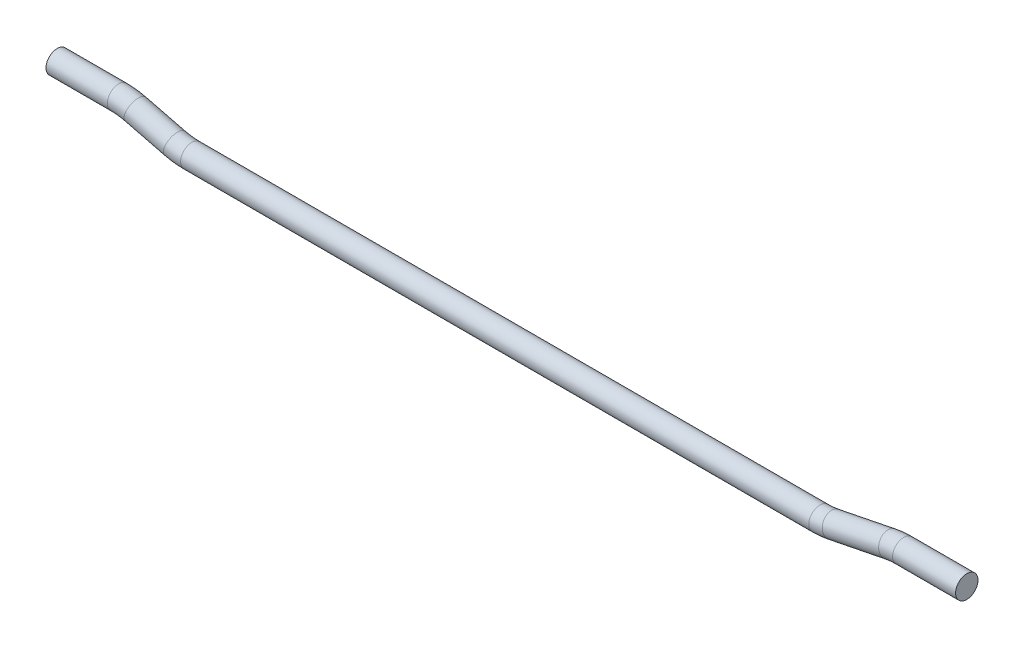
ISO-10303-21;
HEADER;
FILE_DESCRIPTION(('STEP AP214'),'2;1');
FILE_NAME('part.step','',(''),(''),'','','');
FILE_SCHEMA(('AUTOMOTIVE_DESIGN { 1 0 10303 214 1 1 1 1 }'));
ENDSEC;
DATA;
#1=APPLICATION_CONTEXT('core data for automotive mechanical design processes');
#2=APPLICATION_PROTOCOL_DEFINITION('international standard','automotive_design',2000,#1);
#3=PRODUCT_CONTEXT('',#1,'mechanical');
#4=PRODUCT('Part','Part','',(#3));
#5=PRODUCT_RELATED_PRODUCT_CATEGORY('part','',(#4));
#6=PRODUCT_DEFINITION_FORMATION('','',#4);
#7=PRODUCT_DEFINITION_CONTEXT('part definition',#1,'design');
#8=PRODUCT_DEFINITION('design','',#6,#7);
#9=PRODUCT_DEFINITION_SHAPE('','',#8);
#10=(LENGTH_UNIT() NAMED_UNIT(*) SI_UNIT(.MILLI.,.METRE.));
#11=(NAMED_UNIT(*) PLANE_ANGLE_UNIT() SI_UNIT($,.RADIAN.));
#12=(NAMED_UNIT(*) SI_UNIT($,.STERADIAN.) SOLID_ANGLE_UNIT());
#13=UNCERTAINTY_MEASURE_WITH_UNIT(LENGTH_MEASURE(1.E-05),#10,'distance_accuracy_value','');
#14=(GEOMETRIC_REPRESENTATION_CONTEXT(3) GLOBAL_UNCERTAINTY_ASSIGNED_CONTEXT((#13)) GLOBAL_UNIT_ASSIGNED_CONTEXT((#10,
#11,#12)) REPRESENTATION_CONTEXT('',''));
#15=CARTESIAN_POINT('',(0.,0.,0.));
#16=DIRECTION('',(0.,0.,1.));
#17=DIRECTION('',(1.,0.,0.));
#18=AXIS2_PLACEMENT_3D('',#15,#16,#17);
#19=CARTESIAN_POINT('',(60.4950975679639,0.,0.));
#20=DIRECTION('',(1.,0.,0.));
#21=DIRECTION('',(0.,1.,0.));
#22=AXIS2_PLACEMENT_3D('',#19,#20,#21);
#23=CYLINDRICAL_SURFACE('',#22,0.8);
#24=CARTESIAN_POINT('',(60.4950975679639,0.,0.));
#25=DIRECTION('',(1.,0.,0.));
#26=DIRECTION('',(0.,0.,-1.));
#27=AXIS2_PLACEMENT_3D('',#24,#25,#26);
#28=CIRCLE('',#27,0.8);
#29=CARTESIAN_POINT('',(60.4950975679639,0.799999999999997,0.));
#30=VERTEX_POINT('',#29);
#31=EDGE_CURVE('E39',#30,#30,#28,.T.);
#32=ORIENTED_EDGE('',*,*,#31,.T.);
#33=EDGE_LOOP('',(#32));
#34=FACE_BOUND('',#33,.T.);
#35=CARTESIAN_POINT('',(65.,0.,0.));
#36=DIRECTION('',(1.,0.,0.));
#37=DIRECTION('',(0.,0.,-1.));
#38=AXIS2_PLACEMENT_3D('',#35,#36,#37);
#39=CIRCLE('',#38,0.8);
#40=CARTESIAN_POINT('',(65.,0.,-0.8));
#41=VERTEX_POINT('',#40);
#42=EDGE_CURVE('E10',#41,#41,#39,.T.);
#43=ORIENTED_EDGE('',*,*,#42,.F.);
#44=EDGE_LOOP('',(#43));
#45=FACE_BOUND('',#44,.T.);
#46=ADVANCED_FACE('F33',(#34,#45),#23,.T.);
#47=CARTESIAN_POINT('',(60.4950975679639,-5.,0.));
#48=DIRECTION('',(0.,0.,-1.));
#49=DIRECTION('',(-1.,0.,0.));
#50=AXIS2_PLACEMENT_3D('',#47,#48,#49);
#51=TOROIDAL_SURFACE('',#50,5.,0.8);
#52=CARTESIAN_POINT('',(59.514516892273,-0.0970966215454033,0.));
#53=DIRECTION('',(0.98058067569092,0.196116135138183,0.));
#54=DIRECTION('',(0.,0.,-1.));
#55=AXIS2_PLACEMENT_3D('',#52,#53,#54);
#56=CIRCLE('',#55,0.8);
#57=CARTESIAN_POINT('',(59.3576239841625,0.687367919007333,0.));
#58=VERTEX_POINT('',#57);
#59=EDGE_CURVE('E43',#58,#58,#56,.T.);
#60=CARTESIAN_POINT('',(60.4950975679639,-5.,0.));
#61=DIRECTION('',(0.,0.,-1.));
#62=DIRECTION('',(-1.,0.,0.));
#63=AXIS2_PLACEMENT_3D('',#60,#61,#62);
#64=CIRCLE('',#63,5.8);
#65=EDGE_CURVE('',#58,#30,#64,.T.);
#66=ORIENTED_EDGE('',*,*,#59,.T.);
#67=ORIENTED_EDGE('',*,*,#31,.F.);
#68=ORIENTED_EDGE('',*,*,#65,.T.);
#69=ORIENTED_EDGE('',*,*,#65,.F.);
#70=EDGE_LOOP('',(#66,#68,#67,#69));
#71=FACE_BOUND('',#70,.T.);
#72=ADVANCED_FACE('F89',(#71),#51,.T.);
#73=CARTESIAN_POINT('',(55.485483107727,-0.902903378454601,0.));
#74=DIRECTION('',(0.98058067569092,0.196116135138183,0.));
#75=DIRECTION('',(-0.196116135138183,0.98058067569092,0.));
#76=AXIS2_PLACEMENT_3D('',#73,#74,#75);
#77=CYLINDRICAL_SURFACE('',#76,0.8);
#78=CARTESIAN_POINT('',(55.485483107727,-0.902903378454601,0.));
#79=DIRECTION('',(0.98058067569092,0.196116135138183,0.));
#80=DIRECTION('',(0.,0.,-1.));
#81=AXIS2_PLACEMENT_3D('',#78,#79,#80);
#82=CIRCLE('',#81,0.8);
#83=CARTESIAN_POINT('',(55.6423760158375,-1.68736791900734,0.));
#84=VERTEX_POINT('',#83);
#85=EDGE_CURVE('E47',#84,#84,#82,.T.);
#86=ORIENTED_EDGE('',*,*,#85,.T.);
#87=EDGE_LOOP('',(#86));
#88=FACE_BOUND('',#87,.T.);
#89=ORIENTED_EDGE('',*,*,#59,.F.);
#90=EDGE_LOOP('',(#89));
#91=FACE_BOUND('',#90,.T.);
#92=ADVANCED_FACE('F93',(#88,#91),#77,.T.);
#93=CARTESIAN_POINT('',(54.5049024320361,4.,0.));
#94=DIRECTION('',(0.,0.,1.));
#95=DIRECTION('',(1.,0.,0.));
#96=AXIS2_PLACEMENT_3D('',#93,#94,#95);
#97=TOROIDAL_SURFACE('',#96,5.,0.8);
#98=CARTESIAN_POINT('',(54.5049024320361,-1.,0.));
#99=DIRECTION('',(1.,0.,0.));
#100=DIRECTION('',(0.,0.,-1.));
#101=AXIS2_PLACEMENT_3D('',#98,#99,#100);
#102=CIRCLE('',#101,0.8);
#103=CARTESIAN_POINT('',(54.5049024320361,-1.8,0.));
#104=VERTEX_POINT('',#103);
#105=EDGE_CURVE('E52',#104,#104,#102,.T.);
#106=CARTESIAN_POINT('',(54.5049024320361,4.,0.));
#107=DIRECTION('',(0.,0.,1.));
#108=DIRECTION('',(1.,0.,0.));
#109=AXIS2_PLACEMENT_3D('',#106,#107,#108);
#110=CIRCLE('',#109,5.8);
#111=EDGE_CURVE('',#104,#84,#110,.T.);
#112=ORIENTED_EDGE('',*,*,#105,.T.);
#113=ORIENTED_EDGE('',*,*,#85,.F.);
#114=ORIENTED_EDGE('',*,*,#111,.T.);
#115=ORIENTED_EDGE('',*,*,#111,.F.);
#116=EDGE_LOOP('',(#112,#114,#113,#115));
#117=FACE_BOUND('',#116,.T.);
#118=ADVANCED_FACE('F99',(#117),#97,.T.);
#119=CARTESIAN_POINT('',(9.61848804496002,-0.999999999999999,0.));
#120=DIRECTION('',(1.,0.,0.));
#121=DIRECTION('',(0.,1.,0.));
#122=AXIS2_PLACEMENT_3D('',#119,#120,#121);
#123=CYLINDRICAL_SURFACE('',#122,0.8);
#124=CARTESIAN_POINT('',(9.61848804496002,-0.999999999999999,0.));
#125=DIRECTION('',(1.,0.,0.));
#126=DIRECTION('',(0.,0.,-1.));
#127=AXIS2_PLACEMENT_3D('',#124,#125,#126);
#128=CIRCLE('',#127,0.8);
#129=CARTESIAN_POINT('',(9.61848804496002,-1.8,0.));
#130=VERTEX_POINT('',#129);
#131=EDGE_CURVE('E55',#130,#130,#128,.T.);
#132=ORIENTED_EDGE('',*,*,#131,.T.);
#133=EDGE_LOOP('',(#132));
#134=FACE_BOUND('',#133,.T.);
#135=ORIENTED_EDGE('',*,*,#105,.F.);
#136=EDGE_LOOP('',(#135));
#137=FACE_BOUND('',#136,.T.);
#138=ADVANCED_FACE('F106',(#134,#137),#123,.T.);
#139=CARTESIAN_POINT('',(9.61848804496002,4.,0.));
#140=DIRECTION('',(0.,0.,1.));
#141=DIRECTION('',(1.,0.,0.));
#142=AXIS2_PLACEMENT_3D('',#139,#140,#141);
#143=TOROIDAL_SURFACE('',#142,5.,0.8);
#144=CARTESIAN_POINT('',(8.40680176926139,-0.850960355360946,0.));
#145=DIRECTION('',(0.970192071072189,-0.242337255139724,0.));
#146=DIRECTION('',(0.,0.,-1.));
#147=AXIS2_PLACEMENT_3D('',#144,#145,#146);
#148=CIRCLE('',#147,0.8);
#149=CARTESIAN_POINT('',(8.21293196514961,-1.6271140122187,0.));
#150=VERTEX_POINT('',#149);
#151=EDGE_CURVE('E58',#150,#150,#148,.T.);
#152=CARTESIAN_POINT('',(9.61848804496002,4.,0.));
#153=DIRECTION('',(0.,0.,1.));
#154=DIRECTION('',(1.,0.,0.));
#155=AXIS2_PLACEMENT_3D('',#152,#153,#154);
#156=CIRCLE('',#155,5.8);
#157=EDGE_CURVE('',#150,#130,#156,.T.);
#158=ORIENTED_EDGE('',*,*,#151,.T.);
#159=ORIENTED_EDGE('',*,*,#131,.F.);
#160=ORIENTED_EDGE('',*,*,#157,.T.);
#161=ORIENTED_EDGE('',*,*,#157,.F.);
#162=EDGE_LOOP('',(#158,#160,#159,#161));
#163=FACE_BOUND('',#162,.T.);
#164=ADVANCED_FACE('F110',(#163),#143,.T.);
#165=CARTESIAN_POINT('',(5.59667706238917,-0.149039644639054,0.));
#166=DIRECTION('',(0.970192071072189,-0.242337255139724,0.));
#167=DIRECTION('',(0.242337255139724,0.970192071072189,0.));
#168=AXIS2_PLACEMENT_3D('',#165,#166,#167);
#169=CYLINDRICAL_SURFACE('',#168,0.8);
#170=CARTESIAN_POINT('',(5.59667706238917,-0.149039644639054,0.));
#171=DIRECTION('',(0.970192071072189,-0.242337255139724,0.));
#172=DIRECTION('',(0.,0.,-1.));
#173=AXIS2_PLACEMENT_3D('',#170,#171,#172);
#174=CIRCLE('',#173,0.8);
#175=CARTESIAN_POINT('',(5.79054686650095,0.627114012218699,0.));
#176=VERTEX_POINT('',#175);
#177=EDGE_CURVE('E61',#176,#176,#174,.T.);
#178=ORIENTED_EDGE('',*,*,#177,.T.);
#179=EDGE_LOOP('',(#178));
#180=FACE_BOUND('',#179,.T.);
#181=ORIENTED_EDGE('',*,*,#151,.F.);
#182=EDGE_LOOP('',(#181));
#183=FACE_BOUND('',#182,.T.);
#184=ADVANCED_FACE('F114',(#180,#183),#169,.T.);
#185=CARTESIAN_POINT('',(4.38499078669055,-5.,0.));
#186=DIRECTION('',(0.,0.,-1.));
#187=DIRECTION('',(-1.,0.,0.));
#188=AXIS2_PLACEMENT_3D('',#185,#186,#187);
#189=TOROIDAL_SURFACE('',#188,5.,0.8);
#190=CARTESIAN_POINT('',(4.38499078669055,0.,0.));
#191=DIRECTION('',(1.,0.,0.));
#192=DIRECTION('',(0.,0.,-1.));
#193=AXIS2_PLACEMENT_3D('',#190,#191,#192);
#194=CIRCLE('',#193,0.8);
#195=CARTESIAN_POINT('',(4.38499078669055,0.8,0.));
#196=VERTEX_POINT('',#195);
#197=EDGE_CURVE('E64',#196,#196,#194,.T.);
#198=CARTESIAN_POINT('',(4.38499078669055,-5.,0.));
#199=DIRECTION('',(0.,0.,-1.));
#200=DIRECTION('',(-1.,0.,0.));
#201=AXIS2_PLACEMENT_3D('',#198,#199,#200);
#202=CIRCLE('',#201,5.8);
#203=EDGE_CURVE('',#196,#176,#202,.T.);
#204=ORIENTED_EDGE('',*,*,#197,.T.);
#205=ORIENTED_EDGE('',*,*,#177,.F.);
#206=ORIENTED_EDGE('',*,*,#203,.T.);
#207=ORIENTED_EDGE('',*,*,#203,.F.);
#208=EDGE_LOOP('',(#204,#206,#205,#207));
#209=FACE_BOUND('',#208,.T.);
#210=ADVANCED_FACE('F71',(#209),#189,.T.);
#211=CARTESIAN_POINT('',(4.38499078669055,0.,0.));
#212=DIRECTION('',(-1.,0.,0.));
#213=DIRECTION('',(0.,0.,1.));
#214=AXIS2_PLACEMENT_3D('',#211,#212,#213);
#215=CYLINDRICAL_SURFACE('',#214,0.8);
#216=ORIENTED_EDGE('',*,*,#197,.F.);
#217=EDGE_LOOP('',(#216));
#218=FACE_BOUND('',#217,.T.);
#219=CARTESIAN_POINT('',(0.,0.,0.));
#220=DIRECTION('',(1.,0.,0.));
#221=DIRECTION('',(0.,0.,-1.));
#222=AXIS2_PLACEMENT_3D('',#219,#220,#221);
#223=CIRCLE('',#222,0.8);
#224=CARTESIAN_POINT('',(0.,0.,-0.8));
#225=VERTEX_POINT('',#224);
#226=EDGE_CURVE('E65',#225,#225,#223,.T.);
#227=ORIENTED_EDGE('',*,*,#226,.T.);
#228=EDGE_LOOP('',(#227));
#229=FACE_BOUND('',#228,.T.);
#230=ADVANCED_FACE('F74',(#218,#229),#215,.T.);
#231=CARTESIAN_POINT('',(65.,0.,0.));
#232=DIRECTION('',(1.,0.,0.));
#233=DIRECTION('',(0.,0.,-1.));
#234=AXIS2_PLACEMENT_3D('',#231,#232,#233);
#235=PLANE('',#234);
#236=ORIENTED_EDGE('',*,*,#42,.T.);
#237=EDGE_LOOP('',(#236));
#238=FACE_BOUND('',#237,.T.);
#239=ADVANCED_FACE('F77',(#238),#235,.T.);
#240=CARTESIAN_POINT('',(0.,0.,0.));
#241=DIRECTION('',(1.,0.,0.));
#242=DIRECTION('',(0.,0.,-1.));
#243=AXIS2_PLACEMENT_3D('',#240,#241,#242);
#244=PLANE('',#243);
#245=ORIENTED_EDGE('',*,*,#226,.F.);
#246=EDGE_LOOP('',(#245));
#247=FACE_BOUND('',#246,.T.);
#248=ADVANCED_FACE('F81',(#247),#244,.F.);
#249=CLOSED_SHELL('',(#46,#72,#92,#118,#138,#164,#184,#210,#230,#239,#248));
#250=MANIFOLD_SOLID_BREP('B2',#249);
#251=ADVANCED_BREP_SHAPE_REPRESENTATION('',(#18,#250),#14);
#252=SHAPE_DEFINITION_REPRESENTATION(#9,#251);
ENDSEC;
END-ISO-10303-21;
